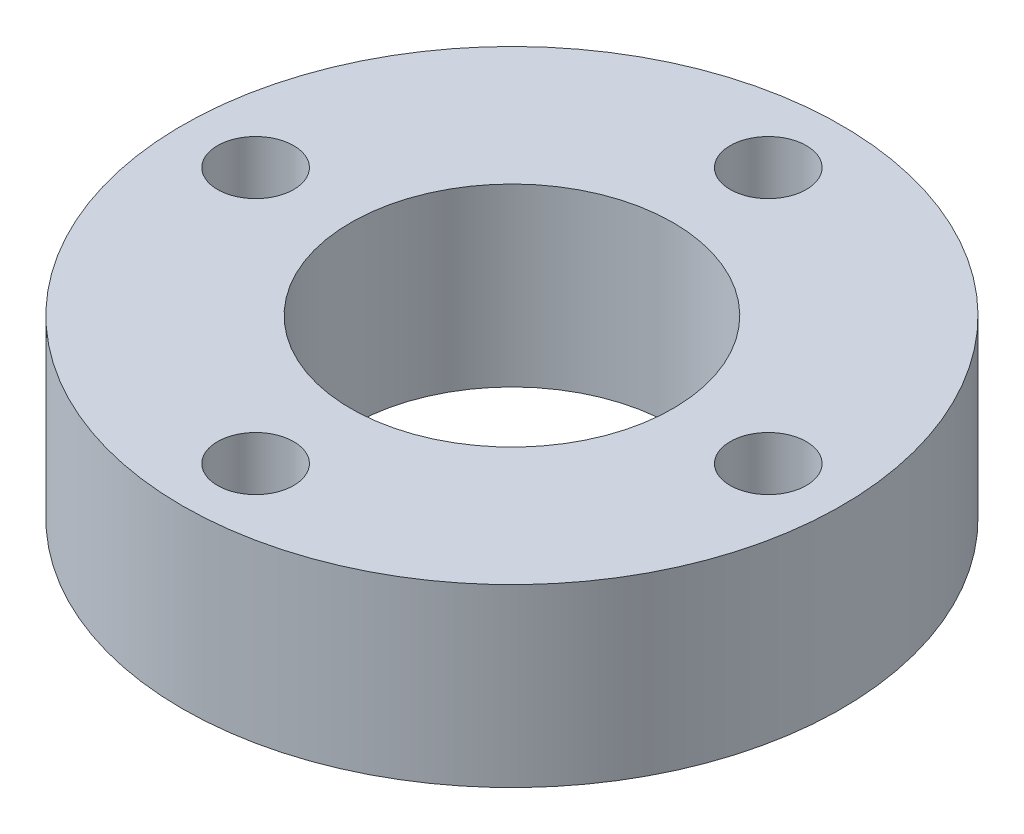
ISO-10303-21;
HEADER;
FILE_DESCRIPTION(('STEP AP214'),'2;1');
FILE_NAME('part.step','',(''),(''),'','','');
FILE_SCHEMA(('AUTOMOTIVE_DESIGN { 1 0 10303 214 1 1 1 1 }'));
ENDSEC;
DATA;
#1=APPLICATION_CONTEXT('core data for automotive mechanical design processes');
#2=APPLICATION_PROTOCOL_DEFINITION('international standard','automotive_design',2000,#1);
#3=PRODUCT_CONTEXT('',#1,'mechanical');
#4=PRODUCT('Part','Part','',(#3));
#5=PRODUCT_RELATED_PRODUCT_CATEGORY('part','',(#4));
#6=PRODUCT_DEFINITION_FORMATION('','',#4);
#7=PRODUCT_DEFINITION_CONTEXT('part definition',#1,'design');
#8=PRODUCT_DEFINITION('design','',#6,#7);
#9=PRODUCT_DEFINITION_SHAPE('','',#8);
#10=(LENGTH_UNIT() NAMED_UNIT(*) SI_UNIT(.MILLI.,.METRE.));
#11=(NAMED_UNIT(*) PLANE_ANGLE_UNIT() SI_UNIT($,.RADIAN.));
#12=(NAMED_UNIT(*) SI_UNIT($,.STERADIAN.) SOLID_ANGLE_UNIT());
#13=UNCERTAINTY_MEASURE_WITH_UNIT(LENGTH_MEASURE(1.E-05),#10,'distance_accuracy_value','');
#14=(GEOMETRIC_REPRESENTATION_CONTEXT(3) GLOBAL_UNCERTAINTY_ASSIGNED_CONTEXT((#13)) GLOBAL_UNIT_ASSIGNED_CONTEXT((#10,
#11,#12)) REPRESENTATION_CONTEXT('',''));
#15=CARTESIAN_POINT('',(0.,0.,0.));
#16=DIRECTION('',(0.,0.,1.));
#17=DIRECTION('',(1.,0.,0.));
#18=AXIS2_PLACEMENT_3D('',#15,#16,#17);
#19=CARTESIAN_POINT('',(0.,12.,0.));
#20=DIRECTION('',(0.,-1.,0.));
#21=DIRECTION('',(0.,0.,-1.));
#22=AXIS2_PLACEMENT_3D('',#19,#20,#21);
#23=CYLINDRICAL_SURFACE('',#22,22.5);
#24=CARTESIAN_POINT('',(0.,12.,0.));
#25=DIRECTION('',(0.,1.,0.));
#26=DIRECTION('',(0.,0.,1.));
#27=AXIS2_PLACEMENT_3D('',#24,#25,#26);
#28=CIRCLE('',#27,22.5);
#29=CARTESIAN_POINT('',(0.,12.,22.5));
#30=VERTEX_POINT('',#29);
#31=EDGE_CURVE('E11',#30,#30,#28,.T.);
#32=ORIENTED_EDGE('',*,*,#31,.F.);
#33=EDGE_LOOP('',(#32));
#34=FACE_BOUND('',#33,.T.);
#35=CARTESIAN_POINT('',(0.,0.,0.));
#36=DIRECTION('',(0.,1.,0.));
#37=DIRECTION('',(0.,0.,1.));
#38=AXIS2_PLACEMENT_3D('',#35,#36,#37);
#39=CIRCLE('',#38,22.5);
#40=CARTESIAN_POINT('',(0.,0.,22.5));
#41=VERTEX_POINT('',#40);
#42=EDGE_CURVE('E54',#41,#41,#39,.T.);
#43=ORIENTED_EDGE('',*,*,#42,.T.);
#44=EDGE_LOOP('',(#43));
#45=FACE_BOUND('',#44,.T.);
#46=ADVANCED_FACE('F48',(#34,#45),#23,.T.);
#47=CARTESIAN_POINT('',(0.,12.,0.));
#48=DIRECTION('',(0.,1.,0.));
#49=DIRECTION('',(0.,0.,1.));
#50=AXIS2_PLACEMENT_3D('',#47,#48,#49);
#51=PLANE('',#50);
#52=CARTESIAN_POINT('',(0.,12.,0.));
#53=DIRECTION('',(0.,-1.,0.));
#54=DIRECTION('',(0.,0.,-1.));
#55=AXIS2_PLACEMENT_3D('',#52,#53,#54);
#56=CIRCLE('',#55,11.);
#57=CARTESIAN_POINT('',(0.,12.,-11.));
#58=VERTEX_POINT('',#57);
#59=EDGE_CURVE('E107',#58,#58,#56,.T.);
#60=ORIENTED_EDGE('',*,*,#59,.T.);
#61=EDGE_LOOP('',(#60));
#62=FACE_BOUND('',#61,.T.);
#63=CARTESIAN_POINT('',(0.,12.,17.5));
#64=DIRECTION('',(0.,-1.,0.));
#65=DIRECTION('',(0.,0.,-1.));
#66=AXIS2_PLACEMENT_3D('',#63,#64,#65);
#67=CIRCLE('',#66,2.6);
#68=CARTESIAN_POINT('',(0.,12.,14.9));
#69=VERTEX_POINT('',#68);
#70=EDGE_CURVE('E66',#69,#69,#67,.T.);
#71=ORIENTED_EDGE('',*,*,#70,.T.);
#72=EDGE_LOOP('',(#71));
#73=FACE_BOUND('',#72,.T.);
#74=CARTESIAN_POINT('',(17.5,12.,0.));
#75=DIRECTION('',(0.,-1.,0.));
#76=DIRECTION('',(0.,0.,-1.));
#77=AXIS2_PLACEMENT_3D('',#74,#75,#76);
#78=CIRCLE('',#77,2.6);
#79=CARTESIAN_POINT('',(17.5,12.,-2.6));
#80=VERTEX_POINT('',#79);
#81=EDGE_CURVE('E112',#80,#80,#78,.T.);
#82=ORIENTED_EDGE('',*,*,#81,.T.);
#83=EDGE_LOOP('',(#82));
#84=FACE_BOUND('',#83,.T.);
#85=CARTESIAN_POINT('',(0.,12.,-17.5));
#86=DIRECTION('',(0.,-1.,0.));
#87=DIRECTION('',(0.,0.,-1.));
#88=AXIS2_PLACEMENT_3D('',#85,#86,#87);
#89=CIRCLE('',#88,2.6);
#90=CARTESIAN_POINT('',(0.,12.,-20.1));
#91=VERTEX_POINT('',#90);
#92=EDGE_CURVE('E110',#91,#91,#89,.T.);
#93=ORIENTED_EDGE('',*,*,#92,.T.);
#94=EDGE_LOOP('',(#93));
#95=FACE_BOUND('',#94,.T.);
#96=CARTESIAN_POINT('',(-17.5,12.,0.));
#97=DIRECTION('',(0.,-1.,0.));
#98=DIRECTION('',(0.,0.,-1.));
#99=AXIS2_PLACEMENT_3D('',#96,#97,#98);
#100=CIRCLE('',#99,2.6);
#101=CARTESIAN_POINT('',(-17.5,12.,-2.6));
#102=VERTEX_POINT('',#101);
#103=EDGE_CURVE('E102',#102,#102,#100,.T.);
#104=ORIENTED_EDGE('',*,*,#103,.T.);
#105=EDGE_LOOP('',(#104));
#106=FACE_BOUND('',#105,.T.);
#107=ORIENTED_EDGE('',*,*,#31,.T.);
#108=EDGE_LOOP('',(#107));
#109=FACE_BOUND('',#108,.T.);
#110=ADVANCED_FACE('F124',(#62,#73,#84,#95,#106,#109),#51,.T.);
#111=CARTESIAN_POINT('',(0.,0.,0.));
#112=DIRECTION('',(0.,1.,0.));
#113=DIRECTION('',(0.,0.,1.));
#114=AXIS2_PLACEMENT_3D('',#111,#112,#113);
#115=PLANE('',#114);
#116=CARTESIAN_POINT('',(0.,0.,0.));
#117=DIRECTION('',(0.,-1.,0.));
#118=DIRECTION('',(0.,0.,-1.));
#119=AXIS2_PLACEMENT_3D('',#116,#117,#118);
#120=CIRCLE('',#119,11.);
#121=CARTESIAN_POINT('',(0.,0.,-11.));
#122=VERTEX_POINT('',#121);
#123=EDGE_CURVE('E116',#122,#122,#120,.T.);
#124=ORIENTED_EDGE('',*,*,#123,.F.);
#125=EDGE_LOOP('',(#124));
#126=FACE_BOUND('',#125,.T.);
#127=CARTESIAN_POINT('',(17.5,0.,0.));
#128=DIRECTION('',(0.,-1.,0.));
#129=DIRECTION('',(0.,0.,-1.));
#130=AXIS2_PLACEMENT_3D('',#127,#128,#129);
#131=CIRCLE('',#130,4.2);
#132=CARTESIAN_POINT('',(17.5,0.,-4.2));
#133=VERTEX_POINT('',#132);
#134=EDGE_CURVE('E97',#133,#133,#131,.T.);
#135=ORIENTED_EDGE('',*,*,#134,.F.);
#136=EDGE_LOOP('',(#135));
#137=FACE_BOUND('',#136,.T.);
#138=CARTESIAN_POINT('',(0.,0.,-17.5));
#139=DIRECTION('',(0.,-1.,0.));
#140=DIRECTION('',(0.,0.,-1.));
#141=AXIS2_PLACEMENT_3D('',#138,#139,#140);
#142=CIRCLE('',#141,4.2);
#143=CARTESIAN_POINT('',(0.,0.,-21.7));
#144=VERTEX_POINT('',#143);
#145=EDGE_CURVE('E96',#144,#144,#142,.T.);
#146=ORIENTED_EDGE('',*,*,#145,.F.);
#147=EDGE_LOOP('',(#146));
#148=FACE_BOUND('',#147,.T.);
#149=CARTESIAN_POINT('',(0.,0.,17.5));
#150=DIRECTION('',(0.,-1.,0.));
#151=DIRECTION('',(0.,0.,-1.));
#152=AXIS2_PLACEMENT_3D('',#149,#150,#151);
#153=CIRCLE('',#152,4.2);
#154=CARTESIAN_POINT('',(0.,0.,13.3));
#155=VERTEX_POINT('',#154);
#156=EDGE_CURVE('E86',#155,#155,#153,.T.);
#157=ORIENTED_EDGE('',*,*,#156,.F.);
#158=EDGE_LOOP('',(#157));
#159=FACE_BOUND('',#158,.T.);
#160=CARTESIAN_POINT('',(-17.5,0.,0.));
#161=DIRECTION('',(0.,-1.,0.));
#162=DIRECTION('',(0.,0.,-1.));
#163=AXIS2_PLACEMENT_3D('',#160,#161,#162);
#164=CIRCLE('',#163,4.2);
#165=CARTESIAN_POINT('',(-17.5,0.,-4.2));
#166=VERTEX_POINT('',#165);
#167=EDGE_CURVE('E80',#166,#166,#164,.T.);
#168=ORIENTED_EDGE('',*,*,#167,.F.);
#169=EDGE_LOOP('',(#168));
#170=FACE_BOUND('',#169,.T.);
#171=ORIENTED_EDGE('',*,*,#42,.F.);
#172=EDGE_LOOP('',(#171));
#173=FACE_BOUND('',#172,.T.);
#174=ADVANCED_FACE('F132',(#126,#137,#148,#159,#170,#173),#115,.F.);
#175=CARTESIAN_POINT('',(-17.5,4.4,0.));
#176=DIRECTION('',(0.,-1.,0.));
#177=DIRECTION('',(0.,0.,-1.));
#178=AXIS2_PLACEMENT_3D('',#175,#176,#177);
#179=CYLINDRICAL_SURFACE('',#178,4.2);
#180=ORIENTED_EDGE('',*,*,#167,.T.);
#181=EDGE_LOOP('',(#180));
#182=FACE_BOUND('',#181,.T.);
#183=CARTESIAN_POINT('',(-17.5,4.4,0.));
#184=DIRECTION('',(0.,-1.,0.));
#185=DIRECTION('',(0.,0.,-1.));
#186=AXIS2_PLACEMENT_3D('',#183,#184,#185);
#187=CIRCLE('',#186,4.2);
#188=CARTESIAN_POINT('',(-17.5,4.4,-4.2));
#189=VERTEX_POINT('',#188);
#190=EDGE_CURVE('E64',#189,#189,#187,.T.);
#191=ORIENTED_EDGE('',*,*,#190,.F.);
#192=EDGE_LOOP('',(#191));
#193=FACE_BOUND('',#192,.T.);
#194=ADVANCED_FACE('F135',(#182,#193),#179,.F.);
#195=CARTESIAN_POINT('',(0.,4.4,0.));
#196=DIRECTION('',(0.,-1.,0.));
#197=DIRECTION('',(0.,0.,-1.));
#198=AXIS2_PLACEMENT_3D('',#195,#196,#197);
#199=PLANE('',#198);
#200=CARTESIAN_POINT('',(-17.5,4.4,0.));
#201=DIRECTION('',(0.,-1.,0.));
#202=DIRECTION('',(0.,0.,-1.));
#203=AXIS2_PLACEMENT_3D('',#200,#201,#202);
#204=CIRCLE('',#203,2.6);
#205=CARTESIAN_POINT('',(-17.5,4.4,-2.6));
#206=VERTEX_POINT('',#205);
#207=EDGE_CURVE('E51',#206,#206,#204,.T.);
#208=ORIENTED_EDGE('',*,*,#207,.F.);
#209=EDGE_LOOP('',(#208));
#210=FACE_BOUND('',#209,.T.);
#211=ORIENTED_EDGE('',*,*,#190,.T.);
#212=EDGE_LOOP('',(#211));
#213=FACE_BOUND('',#212,.T.);
#214=ADVANCED_FACE('F156',(#210,#213),#199,.T.);
#215=CARTESIAN_POINT('',(0.,4.4,17.5));
#216=DIRECTION('',(0.,-1.,0.));
#217=DIRECTION('',(0.,0.,-1.));
#218=AXIS2_PLACEMENT_3D('',#215,#216,#217);
#219=CYLINDRICAL_SURFACE('',#218,4.2);
#220=CARTESIAN_POINT('',(0.,4.4,17.5));
#221=DIRECTION('',(0.,-1.,0.));
#222=DIRECTION('',(0.,0.,-1.));
#223=AXIS2_PLACEMENT_3D('',#220,#221,#222);
#224=CIRCLE('',#223,4.2);
#225=CARTESIAN_POINT('',(0.,4.4,13.3));
#226=VERTEX_POINT('',#225);
#227=EDGE_CURVE('E85',#226,#226,#224,.T.);
#228=ORIENTED_EDGE('',*,*,#227,.F.);
#229=EDGE_LOOP('',(#228));
#230=FACE_BOUND('',#229,.T.);
#231=ORIENTED_EDGE('',*,*,#156,.T.);
#232=EDGE_LOOP('',(#231));
#233=FACE_BOUND('',#232,.T.);
#234=ADVANCED_FACE('F157',(#230,#233),#219,.F.);
#235=CARTESIAN_POINT('',(0.,4.4,0.));
#236=DIRECTION('',(0.,-1.,0.));
#237=DIRECTION('',(0.,0.,-1.));
#238=AXIS2_PLACEMENT_3D('',#235,#236,#237);
#239=PLANE('',#238);
#240=CARTESIAN_POINT('',(0.,4.4,17.5));
#241=DIRECTION('',(0.,-1.,0.));
#242=DIRECTION('',(0.,0.,-1.));
#243=AXIS2_PLACEMENT_3D('',#240,#241,#242);
#244=CIRCLE('',#243,2.6);
#245=CARTESIAN_POINT('',(0.,4.4,14.9));
#246=VERTEX_POINT('',#245);
#247=EDGE_CURVE('E75',#246,#246,#244,.T.);
#248=ORIENTED_EDGE('',*,*,#247,.F.);
#249=EDGE_LOOP('',(#248));
#250=FACE_BOUND('',#249,.T.);
#251=ORIENTED_EDGE('',*,*,#227,.T.);
#252=EDGE_LOOP('',(#251));
#253=FACE_BOUND('',#252,.T.);
#254=ADVANCED_FACE('F165',(#250,#253),#239,.T.);
#255=CARTESIAN_POINT('',(0.,4.4,-17.5));
#256=DIRECTION('',(0.,-1.,0.));
#257=DIRECTION('',(0.,0.,-1.));
#258=AXIS2_PLACEMENT_3D('',#255,#256,#257);
#259=CYLINDRICAL_SURFACE('',#258,4.2);
#260=CARTESIAN_POINT('',(0.,4.4,-17.5));
#261=DIRECTION('',(0.,-1.,0.));
#262=DIRECTION('',(0.,0.,-1.));
#263=AXIS2_PLACEMENT_3D('',#260,#261,#262);
#264=CIRCLE('',#263,4.2);
#265=CARTESIAN_POINT('',(0.,4.4,-21.7));
#266=VERTEX_POINT('',#265);
#267=EDGE_CURVE('E91',#266,#266,#264,.T.);
#268=ORIENTED_EDGE('',*,*,#267,.F.);
#269=EDGE_LOOP('',(#268));
#270=FACE_BOUND('',#269,.T.);
#271=ORIENTED_EDGE('',*,*,#145,.T.);
#272=EDGE_LOOP('',(#271));
#273=FACE_BOUND('',#272,.T.);
#274=ADVANCED_FACE('F164',(#270,#273),#259,.F.);
#275=CARTESIAN_POINT('',(0.,4.4,0.));
#276=DIRECTION('',(0.,-1.,0.));
#277=DIRECTION('',(0.,0.,-1.));
#278=AXIS2_PLACEMENT_3D('',#275,#276,#277);
#279=PLANE('',#278);
#280=CARTESIAN_POINT('',(0.,4.4,-17.5));
#281=DIRECTION('',(0.,-1.,0.));
#282=DIRECTION('',(0.,0.,-1.));
#283=AXIS2_PLACEMENT_3D('',#280,#281,#282);
#284=CIRCLE('',#283,2.6);
#285=CARTESIAN_POINT('',(0.,4.4,-20.1));
#286=VERTEX_POINT('',#285);
#287=EDGE_CURVE('E70',#286,#286,#284,.T.);
#288=ORIENTED_EDGE('',*,*,#287,.F.);
#289=EDGE_LOOP('',(#288));
#290=FACE_BOUND('',#289,.T.);
#291=ORIENTED_EDGE('',*,*,#267,.T.);
#292=EDGE_LOOP('',(#291));
#293=FACE_BOUND('',#292,.T.);
#294=ADVANCED_FACE('F168',(#290,#293),#279,.T.);
#295=CARTESIAN_POINT('',(17.5,4.4,0.));
#296=DIRECTION('',(0.,-1.,0.));
#297=DIRECTION('',(0.,0.,-1.));
#298=AXIS2_PLACEMENT_3D('',#295,#296,#297);
#299=CYLINDRICAL_SURFACE('',#298,4.2);
#300=CARTESIAN_POINT('',(17.5,4.4,0.));
#301=DIRECTION('',(0.,-1.,0.));
#302=DIRECTION('',(0.,0.,-1.));
#303=AXIS2_PLACEMENT_3D('',#300,#301,#302);
#304=CIRCLE('',#303,4.2);
#305=CARTESIAN_POINT('',(17.5,4.4,-4.2));
#306=VERTEX_POINT('',#305);
#307=EDGE_CURVE('E58',#306,#306,#304,.T.);
#308=ORIENTED_EDGE('',*,*,#307,.F.);
#309=EDGE_LOOP('',(#308));
#310=FACE_BOUND('',#309,.T.);
#311=ORIENTED_EDGE('',*,*,#134,.T.);
#312=EDGE_LOOP('',(#311));
#313=FACE_BOUND('',#312,.T.);
#314=ADVANCED_FACE('F174',(#310,#313),#299,.F.);
#315=CARTESIAN_POINT('',(0.,4.4,0.));
#316=DIRECTION('',(0.,-1.,0.));
#317=DIRECTION('',(0.,0.,-1.));
#318=AXIS2_PLACEMENT_3D('',#315,#316,#317);
#319=PLANE('',#318);
#320=CARTESIAN_POINT('',(17.5,4.4,0.));
#321=DIRECTION('',(0.,-1.,0.));
#322=DIRECTION('',(0.,0.,-1.));
#323=AXIS2_PLACEMENT_3D('',#320,#321,#322);
#324=CIRCLE('',#323,2.6);
#325=CARTESIAN_POINT('',(17.5,4.4,-2.6));
#326=VERTEX_POINT('',#325);
#327=EDGE_CURVE('E68',#326,#326,#324,.T.);
#328=ORIENTED_EDGE('',*,*,#327,.F.);
#329=EDGE_LOOP('',(#328));
#330=FACE_BOUND('',#329,.T.);
#331=ORIENTED_EDGE('',*,*,#307,.T.);
#332=EDGE_LOOP('',(#331));
#333=FACE_BOUND('',#332,.T.);
#334=ADVANCED_FACE('F176',(#330,#333),#319,.T.);
#335=CARTESIAN_POINT('',(17.5,12.,0.));
#336=DIRECTION('',(0.,-1.,0.));
#337=DIRECTION('',(0.,0.,-1.));
#338=AXIS2_PLACEMENT_3D('',#335,#336,#337);
#339=CYLINDRICAL_SURFACE('',#338,2.6);
#340=ORIENTED_EDGE('',*,*,#327,.T.);
#341=EDGE_LOOP('',(#340));
#342=FACE_BOUND('',#341,.T.);
#343=ORIENTED_EDGE('',*,*,#81,.F.);
#344=EDGE_LOOP('',(#343));
#345=FACE_BOUND('',#344,.T.);
#346=ADVANCED_FACE('F184',(#342,#345),#339,.F.);
#347=CARTESIAN_POINT('',(0.,12.,-17.5));
#348=DIRECTION('',(0.,-1.,0.));
#349=DIRECTION('',(0.,0.,-1.));
#350=AXIS2_PLACEMENT_3D('',#347,#348,#349);
#351=CYLINDRICAL_SURFACE('',#350,2.6);
#352=ORIENTED_EDGE('',*,*,#287,.T.);
#353=EDGE_LOOP('',(#352));
#354=FACE_BOUND('',#353,.T.);
#355=ORIENTED_EDGE('',*,*,#92,.F.);
#356=EDGE_LOOP('',(#355));
#357=FACE_BOUND('',#356,.T.);
#358=ADVANCED_FACE('F189',(#354,#357),#351,.F.);
#359=CARTESIAN_POINT('',(0.,12.,17.5));
#360=DIRECTION('',(0.,-1.,0.));
#361=DIRECTION('',(0.,0.,-1.));
#362=AXIS2_PLACEMENT_3D('',#359,#360,#361);
#363=CYLINDRICAL_SURFACE('',#362,2.6);
#364=ORIENTED_EDGE('',*,*,#247,.T.);
#365=EDGE_LOOP('',(#364));
#366=FACE_BOUND('',#365,.T.);
#367=ORIENTED_EDGE('',*,*,#70,.F.);
#368=EDGE_LOOP('',(#367));
#369=FACE_BOUND('',#368,.T.);
#370=ADVANCED_FACE('F187',(#366,#369),#363,.F.);
#371=CARTESIAN_POINT('',(-17.5,12.,0.));
#372=DIRECTION('',(0.,-1.,0.));
#373=DIRECTION('',(0.,0.,-1.));
#374=AXIS2_PLACEMENT_3D('',#371,#372,#373);
#375=CYLINDRICAL_SURFACE('',#374,2.6);
#376=ORIENTED_EDGE('',*,*,#207,.T.);
#377=EDGE_LOOP('',(#376));
#378=FACE_BOUND('',#377,.T.);
#379=ORIENTED_EDGE('',*,*,#103,.F.);
#380=EDGE_LOOP('',(#379));
#381=FACE_BOUND('',#380,.T.);
#382=ADVANCED_FACE('F126',(#378,#381),#375,.F.);
#383=CARTESIAN_POINT('',(0.,12.,0.));
#384=DIRECTION('',(0.,-1.,0.));
#385=DIRECTION('',(0.,0.,-1.));
#386=AXIS2_PLACEMENT_3D('',#383,#384,#385);
#387=CYLINDRICAL_SURFACE('',#386,11.);
#388=ORIENTED_EDGE('',*,*,#59,.F.);
#389=EDGE_LOOP('',(#388));
#390=FACE_BOUND('',#389,.T.);
#391=ORIENTED_EDGE('',*,*,#123,.T.);
#392=EDGE_LOOP('',(#391));
#393=FACE_BOUND('',#392,.T.);
#394=ADVANCED_FACE('F121',(#390,#393),#387,.F.);
#395=CLOSED_SHELL('',(#46,#110,#174,#194,#214,#234,#254,#274,#294,#314,#334,#346,#358,#370,#382,#394));
#396=MANIFOLD_SOLID_BREP('B2',#395);
#397=ADVANCED_BREP_SHAPE_REPRESENTATION('',(#18,#396),#14);
#398=SHAPE_DEFINITION_REPRESENTATION(#9,#397);
ENDSEC;
END-ISO-10303-21;
